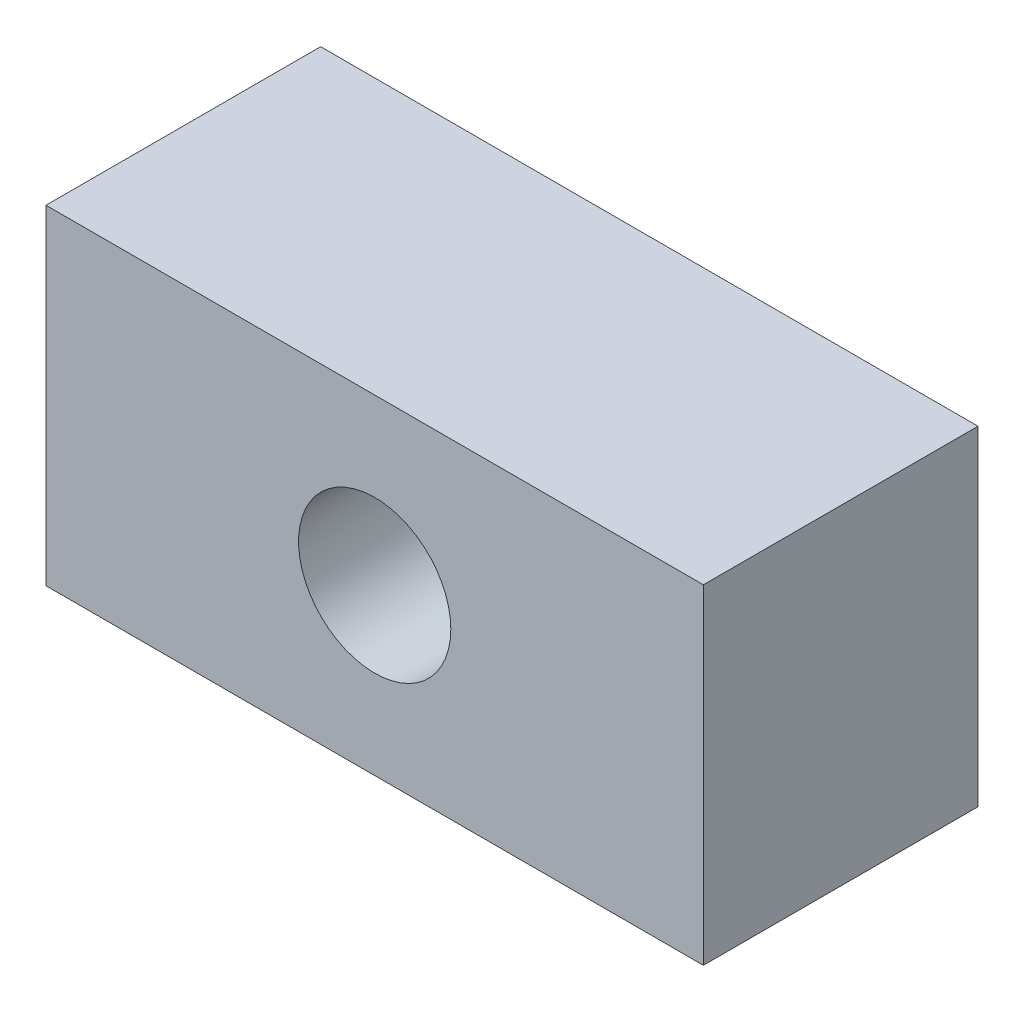
ISO-10303-21;
HEADER;
FILE_DESCRIPTION(('STEP AP214'),'2;1');
FILE_NAME('part.step','',(''),(''),'','','');
FILE_SCHEMA(('AUTOMOTIVE_DESIGN { 1 0 10303 214 1 1 1 1 }'));
ENDSEC;
DATA;
#1=APPLICATION_CONTEXT('core data for automotive mechanical design processes');
#2=APPLICATION_PROTOCOL_DEFINITION('international standard','automotive_design',2000,#1);
#3=PRODUCT_CONTEXT('',#1,'mechanical');
#4=PRODUCT('Part','Part','',(#3));
#5=PRODUCT_RELATED_PRODUCT_CATEGORY('part','',(#4));
#6=PRODUCT_DEFINITION_FORMATION('','',#4);
#7=PRODUCT_DEFINITION_CONTEXT('part definition',#1,'design');
#8=PRODUCT_DEFINITION('design','',#6,#7);
#9=PRODUCT_DEFINITION_SHAPE('','',#8);
#10=(LENGTH_UNIT() NAMED_UNIT(*) SI_UNIT(.MILLI.,.METRE.));
#11=(NAMED_UNIT(*) PLANE_ANGLE_UNIT() SI_UNIT($,.RADIAN.));
#12=(NAMED_UNIT(*) SI_UNIT($,.STERADIAN.) SOLID_ANGLE_UNIT());
#13=UNCERTAINTY_MEASURE_WITH_UNIT(LENGTH_MEASURE(1.E-05),#10,'distance_accuracy_value','');
#14=(GEOMETRIC_REPRESENTATION_CONTEXT(3) GLOBAL_UNCERTAINTY_ASSIGNED_CONTEXT((#13)) GLOBAL_UNIT_ASSIGNED_CONTEXT((#10,
#11,#12)) REPRESENTATION_CONTEXT('',''));
#15=CARTESIAN_POINT('',(0.,0.,0.));
#16=DIRECTION('',(0.,0.,1.));
#17=DIRECTION('',(1.,0.,0.));
#18=AXIS2_PLACEMENT_3D('',#15,#16,#17);
#19=CARTESIAN_POINT('',(19.,9.525,7.9375));
#20=DIRECTION('',(0.,0.,-1.));
#21=DIRECTION('',(0.,1.,0.));
#22=AXIS2_PLACEMENT_3D('',#19,#20,#21);
#23=PLANE('',#22);
#24=CARTESIAN_POINT('',(0.,0.,7.9375));
#25=DIRECTION('',(0.,0.,1.));
#26=DIRECTION('',(1.,0.,0.));
#27=AXIS2_PLACEMENT_3D('',#24,#25,#26);
#28=CIRCLE('',#27,4.39999999999999);
#29=CARTESIAN_POINT('',(4.39999999999999,0.,7.9375));
#30=VERTEX_POINT('',#29);
#31=EDGE_CURVE('E117',#30,#30,#28,.T.);
#32=ORIENTED_EDGE('',*,*,#31,.F.);
#33=EDGE_LOOP('',(#32));
#34=FACE_BOUND('',#33,.T.);
#35=DIRECTION('',(0.,-1.,0.));
#36=VECTOR('',#35,1.);
#37=CARTESIAN_POINT('',(-19.,9.525,7.9375));
#38=LINE('',#37,#36);
#39=CARTESIAN_POINT('',(-19.,9.525,7.9375));
#40=VERTEX_POINT('',#39);
#41=CARTESIAN_POINT('',(-19.,-9.525,7.9375));
#42=VERTEX_POINT('',#41);
#43=EDGE_CURVE('E101',#40,#42,#38,.T.);
#44=ORIENTED_EDGE('',*,*,#43,.T.);
#45=DIRECTION('',(-1.,0.,0.));
#46=VECTOR('',#45,1.);
#47=CARTESIAN_POINT('',(19.,-9.525,7.9375));
#48=LINE('',#47,#46);
#49=CARTESIAN_POINT('',(19.,-9.525,7.9375));
#50=VERTEX_POINT('',#49);
#51=EDGE_CURVE('E11',#50,#42,#48,.T.);
#52=ORIENTED_EDGE('',*,*,#51,.F.);
#53=DIRECTION('',(0.,-1.,0.));
#54=VECTOR('',#53,1.);
#55=CARTESIAN_POINT('',(19.,9.525,7.9375));
#56=LINE('',#55,#54);
#57=CARTESIAN_POINT('',(19.,9.525,7.9375));
#58=VERTEX_POINT('',#57);
#59=EDGE_CURVE('E89',#58,#50,#56,.T.);
#60=ORIENTED_EDGE('',*,*,#59,.F.);
#61=DIRECTION('',(-1.,0.,0.));
#62=VECTOR('',#61,1.);
#63=CARTESIAN_POINT('',(19.,9.525,7.9375));
#64=LINE('',#63,#62);
#65=EDGE_CURVE('E97',#58,#40,#64,.T.);
#66=ORIENTED_EDGE('',*,*,#65,.T.);
#67=EDGE_LOOP('',(#44,#52,#60,#66));
#68=FACE_BOUND('',#67,.T.);
#69=ADVANCED_FACE('F38',(#34,#68),#23,.F.);
#70=CARTESIAN_POINT('',(19.,-9.525,7.9375));
#71=DIRECTION('',(0.,1.,0.));
#72=DIRECTION('',(0.,0.,1.));
#73=AXIS2_PLACEMENT_3D('',#70,#71,#72);
#74=PLANE('',#73);
#75=DIRECTION('',(0.,0.,-1.));
#76=VECTOR('',#75,1.);
#77=CARTESIAN_POINT('',(-19.,-9.525,7.9375));
#78=LINE('',#77,#76);
#79=CARTESIAN_POINT('',(-19.,-9.525,-7.9375));
#80=VERTEX_POINT('',#79);
#81=EDGE_CURVE('E93',#42,#80,#78,.T.);
#82=ORIENTED_EDGE('',*,*,#81,.T.);
#83=DIRECTION('',(-1.,0.,0.));
#84=VECTOR('',#83,1.);
#85=CARTESIAN_POINT('',(19.,-9.525,-7.9375));
#86=LINE('',#85,#84);
#87=CARTESIAN_POINT('',(19.,-9.525,-7.9375));
#88=VERTEX_POINT('',#87);
#89=EDGE_CURVE('E46',#88,#80,#86,.T.);
#90=ORIENTED_EDGE('',*,*,#89,.F.);
#91=DIRECTION('',(0.,0.,-1.));
#92=VECTOR('',#91,1.);
#93=CARTESIAN_POINT('',(19.,-9.525,7.9375));
#94=LINE('',#93,#92);
#95=EDGE_CURVE('E84',#50,#88,#94,.T.);
#96=ORIENTED_EDGE('',*,*,#95,.F.);
#97=ORIENTED_EDGE('',*,*,#51,.T.);
#98=EDGE_LOOP('',(#82,#90,#96,#97));
#99=FACE_BOUND('',#98,.T.);
#100=ADVANCED_FACE('F92',(#99),#74,.F.);
#101=CARTESIAN_POINT('',(19.,9.525,-7.9375));
#102=DIRECTION('',(0.,0.,1.));
#103=DIRECTION('',(0.,-1.,0.));
#104=AXIS2_PLACEMENT_3D('',#101,#102,#103);
#105=PLANE('',#104);
#106=CARTESIAN_POINT('',(0.,0.,-7.9375));
#107=DIRECTION('',(0.,0.,1.));
#108=DIRECTION('',(1.,0.,0.));
#109=AXIS2_PLACEMENT_3D('',#106,#107,#108);
#110=CIRCLE('',#109,4.4);
#111=CARTESIAN_POINT('',(4.4,0.,-7.9375));
#112=VERTEX_POINT('',#111);
#113=EDGE_CURVE('E104',#112,#112,#110,.T.);
#114=ORIENTED_EDGE('',*,*,#113,.T.);
#115=EDGE_LOOP('',(#114));
#116=FACE_BOUND('',#115,.T.);
#117=DIRECTION('',(0.,1.,0.));
#118=VECTOR('',#117,1.);
#119=CARTESIAN_POINT('',(-19.,9.525,-7.9375));
#120=LINE('',#119,#118);
#121=CARTESIAN_POINT('',(-19.,9.525,-7.9375));
#122=VERTEX_POINT('',#121);
#123=EDGE_CURVE('E71',#80,#122,#120,.T.);
#124=ORIENTED_EDGE('',*,*,#123,.T.);
#125=DIRECTION('',(-1.,0.,0.));
#126=VECTOR('',#125,1.);
#127=CARTESIAN_POINT('',(19.,9.525,-7.9375));
#128=LINE('',#127,#126);
#129=CARTESIAN_POINT('',(19.,9.525,-7.9375));
#130=VERTEX_POINT('',#129);
#131=EDGE_CURVE('E94',#130,#122,#128,.T.);
#132=ORIENTED_EDGE('',*,*,#131,.F.);
#133=DIRECTION('',(0.,1.,0.));
#134=VECTOR('',#133,1.);
#135=CARTESIAN_POINT('',(19.,9.525,-7.9375));
#136=LINE('',#135,#134);
#137=EDGE_CURVE('E87',#88,#130,#136,.T.);
#138=ORIENTED_EDGE('',*,*,#137,.F.);
#139=ORIENTED_EDGE('',*,*,#89,.T.);
#140=EDGE_LOOP('',(#124,#132,#138,#139));
#141=FACE_BOUND('',#140,.T.);
#142=ADVANCED_FACE('F95',(#116,#141),#105,.F.);
#143=CARTESIAN_POINT('',(19.,9.525,7.9375));
#144=DIRECTION('',(0.,-1.,0.));
#145=DIRECTION('',(0.,0.,-1.));
#146=AXIS2_PLACEMENT_3D('',#143,#144,#145);
#147=PLANE('',#146);
#148=DIRECTION('',(0.,0.,1.));
#149=VECTOR('',#148,1.);
#150=CARTESIAN_POINT('',(-19.,9.525,7.9375));
#151=LINE('',#150,#149);
#152=EDGE_CURVE('E77',#122,#40,#151,.T.);
#153=ORIENTED_EDGE('',*,*,#152,.T.);
#154=ORIENTED_EDGE('',*,*,#65,.F.);
#155=DIRECTION('',(0.,0.,1.));
#156=VECTOR('',#155,1.);
#157=CARTESIAN_POINT('',(19.,9.525,7.9375));
#158=LINE('',#157,#156);
#159=EDGE_CURVE('E54',#130,#58,#158,.T.);
#160=ORIENTED_EDGE('',*,*,#159,.F.);
#161=ORIENTED_EDGE('',*,*,#131,.T.);
#162=EDGE_LOOP('',(#153,#154,#160,#161));
#163=FACE_BOUND('',#162,.T.);
#164=ADVANCED_FACE('F109',(#163),#147,.F.);
#165=CARTESIAN_POINT('',(19.,0.,0.));
#166=DIRECTION('',(1.,0.,0.));
#167=DIRECTION('',(0.,0.,-1.));
#168=AXIS2_PLACEMENT_3D('',#165,#166,#167);
#169=PLANE('',#168);
#170=ORIENTED_EDGE('',*,*,#59,.T.);
#171=ORIENTED_EDGE('',*,*,#95,.T.);
#172=ORIENTED_EDGE('',*,*,#137,.T.);
#173=ORIENTED_EDGE('',*,*,#159,.T.);
#174=EDGE_LOOP('',(#170,#171,#172,#173));
#175=FACE_BOUND('',#174,.T.);
#176=ADVANCED_FACE('F85',(#175),#169,.T.);
#177=CARTESIAN_POINT('',(-19.,0.,0.));
#178=DIRECTION('',(1.,0.,0.));
#179=DIRECTION('',(0.,0.,-1.));
#180=AXIS2_PLACEMENT_3D('',#177,#178,#179);
#181=PLANE('',#180);
#182=ORIENTED_EDGE('',*,*,#43,.F.);
#183=ORIENTED_EDGE('',*,*,#152,.F.);
#184=ORIENTED_EDGE('',*,*,#123,.F.);
#185=ORIENTED_EDGE('',*,*,#81,.F.);
#186=EDGE_LOOP('',(#182,#183,#184,#185));
#187=FACE_BOUND('',#186,.T.);
#188=ADVANCED_FACE('F112',(#187),#181,.F.);
#189=CARTESIAN_POINT('',(0.,0.,7.9375));
#190=DIRECTION('',(0.,0.,1.));
#191=DIRECTION('',(1.,0.,0.));
#192=AXIS2_PLACEMENT_3D('',#189,#190,#191);
#193=CYLINDRICAL_SURFACE('',#192,4.39999999999999);
#194=ORIENTED_EDGE('',*,*,#113,.F.);
#195=EDGE_LOOP('',(#194));
#196=FACE_BOUND('',#195,.T.);
#197=ORIENTED_EDGE('',*,*,#31,.T.);
#198=EDGE_LOOP('',(#197));
#199=FACE_BOUND('',#198,.T.);
#200=ADVANCED_FACE('F121',(#196,#199),#193,.F.);
#201=CLOSED_SHELL('',(#69,#100,#142,#164,#176,#188,#200));
#202=MANIFOLD_SOLID_BREP('B2',#201);
#203=ADVANCED_BREP_SHAPE_REPRESENTATION('',(#18,#202),#14);
#204=SHAPE_DEFINITION_REPRESENTATION(#9,#203);
ENDSEC;
END-ISO-10303-21;
